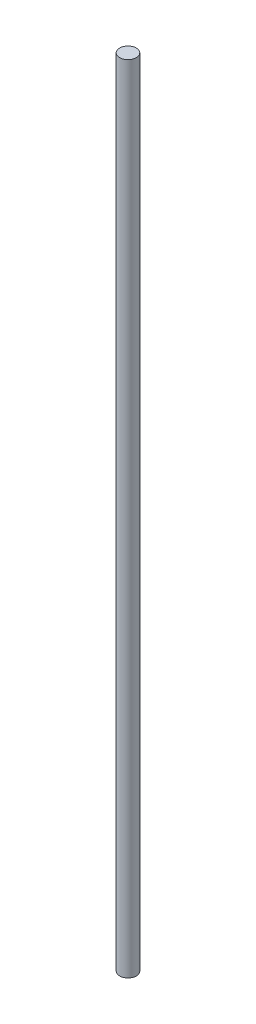
ISO-10303-21;
HEADER;
FILE_DESCRIPTION(('STEP AP214'),'2;1');
FILE_NAME('part.step','',(''),(''),'','','');
FILE_SCHEMA(('AUTOMOTIVE_DESIGN { 1 0 10303 214 1 1 1 1 }'));
ENDSEC;
DATA;
#1=APPLICATION_CONTEXT('core data for automotive mechanical design processes');
#2=APPLICATION_PROTOCOL_DEFINITION('international standard','automotive_design',2000,#1);
#3=PRODUCT_CONTEXT('',#1,'mechanical');
#4=PRODUCT('Part','Part','',(#3));
#5=PRODUCT_RELATED_PRODUCT_CATEGORY('part','',(#4));
#6=PRODUCT_DEFINITION_FORMATION('','',#4);
#7=PRODUCT_DEFINITION_CONTEXT('part definition',#1,'design');
#8=PRODUCT_DEFINITION('design','',#6,#7);
#9=PRODUCT_DEFINITION_SHAPE('','',#8);
#10=(LENGTH_UNIT() NAMED_UNIT(*) SI_UNIT(.MILLI.,.METRE.));
#11=(NAMED_UNIT(*) PLANE_ANGLE_UNIT() SI_UNIT($,.RADIAN.));
#12=(NAMED_UNIT(*) SI_UNIT($,.STERADIAN.) SOLID_ANGLE_UNIT());
#13=UNCERTAINTY_MEASURE_WITH_UNIT(LENGTH_MEASURE(1.E-05),#10,'distance_accuracy_value','');
#14=(GEOMETRIC_REPRESENTATION_CONTEXT(3) GLOBAL_UNCERTAINTY_ASSIGNED_CONTEXT((#13)) GLOBAL_UNIT_ASSIGNED_CONTEXT((#10,
#11,#12)) REPRESENTATION_CONTEXT('',''));
#15=CARTESIAN_POINT('',(0.,0.,0.));
#16=DIRECTION('',(0.,0.,1.));
#17=DIRECTION('',(1.,0.,0.));
#18=AXIS2_PLACEMENT_3D('',#15,#16,#17);
#19=CARTESIAN_POINT('',(0.,143.,0.));
#20=DIRECTION('',(0.,-1.,0.));
#21=DIRECTION('',(0.,0.,-1.));
#22=AXIS2_PLACEMENT_3D('',#19,#20,#21);
#23=CYLINDRICAL_SURFACE('',#22,1.5);
#24=CARTESIAN_POINT('',(0.,143.,0.));
#25=DIRECTION('',(0.,1.,0.));
#26=DIRECTION('',(0.,0.,1.));
#27=AXIS2_PLACEMENT_3D('',#24,#25,#26);
#28=CIRCLE('',#27,1.5);
#29=CARTESIAN_POINT('',(0.,143.,1.5));
#30=VERTEX_POINT('',#29);
#31=EDGE_CURVE('E10',#30,#30,#28,.T.);
#32=ORIENTED_EDGE('',*,*,#31,.F.);
#33=EDGE_LOOP('',(#32));
#34=FACE_BOUND('',#33,.T.);
#35=CARTESIAN_POINT('',(0.,0.,0.));
#36=DIRECTION('',(0.,1.,0.));
#37=DIRECTION('',(0.,0.,1.));
#38=AXIS2_PLACEMENT_3D('',#35,#36,#37);
#39=CIRCLE('',#38,1.5);
#40=CARTESIAN_POINT('',(0.,0.,1.5));
#41=VERTEX_POINT('',#40);
#42=EDGE_CURVE('E37',#41,#41,#39,.T.);
#43=ORIENTED_EDGE('',*,*,#42,.T.);
#44=EDGE_LOOP('',(#43));
#45=FACE_BOUND('',#44,.T.);
#46=ADVANCED_FACE('F34',(#34,#45),#23,.T.);
#47=CARTESIAN_POINT('',(0.,143.,0.));
#48=DIRECTION('',(0.,1.,0.));
#49=DIRECTION('',(0.,0.,1.));
#50=AXIS2_PLACEMENT_3D('',#47,#48,#49);
#51=PLANE('',#50);
#52=ORIENTED_EDGE('',*,*,#31,.T.);
#53=EDGE_LOOP('',(#52));
#54=FACE_BOUND('',#53,.T.);
#55=ADVANCED_FACE('F49',(#54),#51,.T.);
#56=CARTESIAN_POINT('',(0.,0.,0.));
#57=DIRECTION('',(0.,1.,0.));
#58=DIRECTION('',(0.,0.,1.));
#59=AXIS2_PLACEMENT_3D('',#56,#57,#58);
#60=PLANE('',#59);
#61=ORIENTED_EDGE('',*,*,#42,.F.);
#62=EDGE_LOOP('',(#61));
#63=FACE_BOUND('',#62,.T.);
#64=ADVANCED_FACE('F47',(#63),#60,.F.);
#65=CLOSED_SHELL('',(#46,#55,#64));
#66=MANIFOLD_SOLID_BREP('B2',#65);
#67=ADVANCED_BREP_SHAPE_REPRESENTATION('',(#18,#66),#14);
#68=SHAPE_DEFINITION_REPRESENTATION(#9,#67);
ENDSEC;
END-ISO-10303-21;
